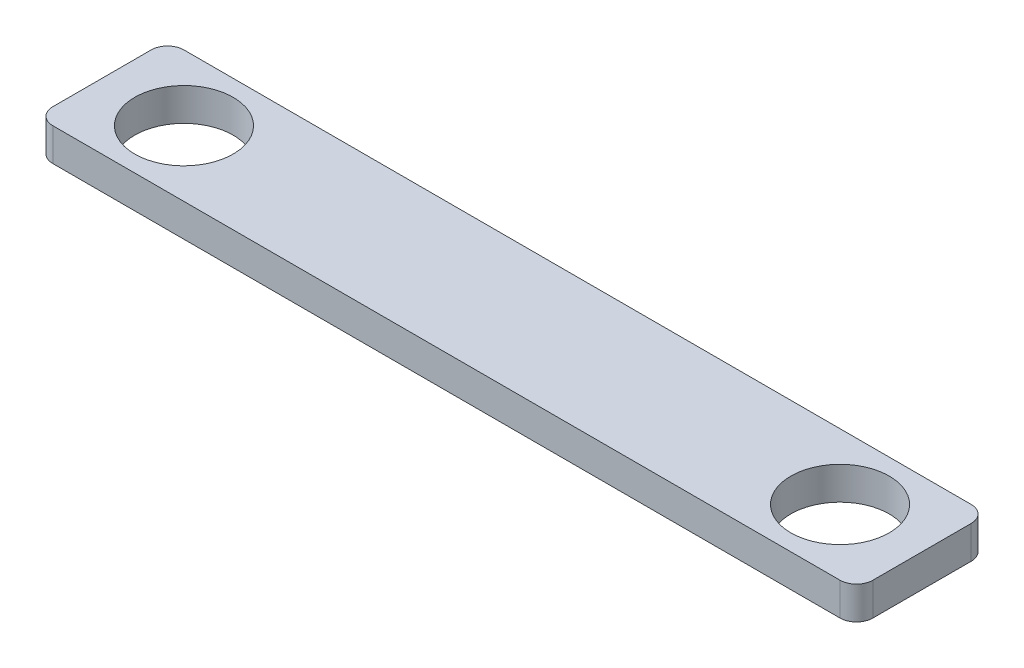
ISO-10303-21;
HEADER;
FILE_DESCRIPTION(('STEP AP214'),'2;1');
FILE_NAME('part.step','',(''),(''),'','','');
FILE_SCHEMA(('AUTOMOTIVE_DESIGN { 1 0 10303 214 1 1 1 1 }'));
ENDSEC;
DATA;
#1=APPLICATION_CONTEXT('core data for automotive mechanical design processes');
#2=APPLICATION_PROTOCOL_DEFINITION('international standard','automotive_design',2000,#1);
#3=PRODUCT_CONTEXT('',#1,'mechanical');
#4=PRODUCT('Part','Part','',(#3));
#5=PRODUCT_RELATED_PRODUCT_CATEGORY('part','',(#4));
#6=PRODUCT_DEFINITION_FORMATION('','',#4);
#7=PRODUCT_DEFINITION_CONTEXT('part definition',#1,'design');
#8=PRODUCT_DEFINITION('design','',#6,#7);
#9=PRODUCT_DEFINITION_SHAPE('','',#8);
#10=(LENGTH_UNIT() NAMED_UNIT(*) SI_UNIT(.MILLI.,.METRE.));
#11=(NAMED_UNIT(*) PLANE_ANGLE_UNIT() SI_UNIT($,.RADIAN.));
#12=(NAMED_UNIT(*) SI_UNIT($,.STERADIAN.) SOLID_ANGLE_UNIT());
#13=UNCERTAINTY_MEASURE_WITH_UNIT(LENGTH_MEASURE(1.E-05),#10,'distance_accuracy_value','');
#14=(GEOMETRIC_REPRESENTATION_CONTEXT(3) GLOBAL_UNCERTAINTY_ASSIGNED_CONTEXT((#13)) GLOBAL_UNIT_ASSIGNED_CONTEXT((#10,
#11,#12)) REPRESENTATION_CONTEXT('',''));
#15=CARTESIAN_POINT('',(0.,0.,0.));
#16=DIRECTION('',(0.,0.,1.));
#17=DIRECTION('',(1.,0.,0.));
#18=AXIS2_PLACEMENT_3D('',#15,#16,#17);
#19=CARTESIAN_POINT('',(60.9600000000001,5.08,7.61999999999998));
#20=DIRECTION('',(0.,1.,0.));
#21=DIRECTION('',(0.,0.,1.));
#22=AXIS2_PLACEMENT_3D('',#19,#20,#21);
#23=PLANE('',#22);
#24=CARTESIAN_POINT('',(-50.8,5.08,0.));
#25=DIRECTION('',(0.,1.,0.));
#26=DIRECTION('',(0.,0.,1.));
#27=AXIS2_PLACEMENT_3D('',#24,#25,#26);
#28=CIRCLE('',#27,7.62);
#29=CARTESIAN_POINT('',(-50.8,5.08,7.62));
#30=VERTEX_POINT('',#29);
#31=EDGE_CURVE('E133',#30,#30,#28,.T.);
#32=ORIENTED_EDGE('',*,*,#31,.F.);
#33=EDGE_LOOP('',(#32));
#34=FACE_BOUND('',#33,.T.);
#35=CARTESIAN_POINT('',(60.9600000000001,5.08,7.61999999999998));
#36=DIRECTION('',(0.,1.,0.));
#37=DIRECTION('',(0.,0.,1.));
#38=AXIS2_PLACEMENT_3D('',#35,#36,#37);
#39=CIRCLE('',#38,2.54);
#40=CARTESIAN_POINT('',(60.96,5.08,10.16));
#41=VERTEX_POINT('',#40);
#42=CARTESIAN_POINT('',(63.5000000000001,5.08,7.61999999999996));
#43=VERTEX_POINT('',#42);
#44=EDGE_CURVE('E144',#41,#43,#39,.T.);
#45=ORIENTED_EDGE('',*,*,#44,.T.);
#46=DIRECTION('',(0.,0.,-1.));
#47=VECTOR('',#46,1.);
#48=CARTESIAN_POINT('',(63.5000000000001,5.08,7.61999999999996));
#49=LINE('',#48,#47);
#50=CARTESIAN_POINT('',(63.5000000000001,5.08,-7.62000000000001));
#51=VERTEX_POINT('',#50);
#52=EDGE_CURVE('E92',#43,#51,#49,.T.);
#53=ORIENTED_EDGE('',*,*,#52,.T.);
#54=CARTESIAN_POINT('',(60.9600000000001,5.08,-7.62000000000002));
#55=DIRECTION('',(0.,1.,0.));
#56=DIRECTION('',(0.,0.,1.));
#57=AXIS2_PLACEMENT_3D('',#54,#55,#56);
#58=CIRCLE('',#57,2.54);
#59=CARTESIAN_POINT('',(60.96,5.08,-10.16));
#60=VERTEX_POINT('',#59);
#61=EDGE_CURVE('E159',#51,#60,#58,.T.);
#62=ORIENTED_EDGE('',*,*,#61,.T.);
#63=DIRECTION('',(-1.,0.,0.));
#64=VECTOR('',#63,1.);
#65=CARTESIAN_POINT('',(60.96,5.08,-10.16));
#66=LINE('',#65,#64);
#67=CARTESIAN_POINT('',(-60.9599999999999,5.08,-10.16));
#68=VERTEX_POINT('',#67);
#69=EDGE_CURVE('E172',#60,#68,#66,.T.);
#70=ORIENTED_EDGE('',*,*,#69,.T.);
#71=CARTESIAN_POINT('',(-60.9599999999999,5.08,-7.61999999999996));
#72=DIRECTION('',(0.,1.,0.));
#73=DIRECTION('',(0.,0.,-1.));
#74=AXIS2_PLACEMENT_3D('',#71,#72,#73);
#75=CIRCLE('',#74,2.54);
#76=CARTESIAN_POINT('',(-63.4999999999999,5.08,-7.61999999999995));
#77=VERTEX_POINT('',#76);
#78=EDGE_CURVE('E111',#68,#77,#75,.T.);
#79=ORIENTED_EDGE('',*,*,#78,.T.);
#80=DIRECTION('',(0.,0.,1.));
#81=VECTOR('',#80,1.);
#82=CARTESIAN_POINT('',(-63.4999999999999,5.08,7.61999999999995));
#83=LINE('',#82,#81);
#84=CARTESIAN_POINT('',(-63.4999999999999,5.08,7.61999999999995));
#85=VERTEX_POINT('',#84);
#86=EDGE_CURVE('E105',#77,#85,#83,.T.);
#87=ORIENTED_EDGE('',*,*,#86,.T.);
#88=CARTESIAN_POINT('',(-60.9599999999999,5.08,7.61999999999996));
#89=DIRECTION('',(0.,1.,0.));
#90=DIRECTION('',(0.,0.,-1.));
#91=AXIS2_PLACEMENT_3D('',#88,#89,#90);
#92=CIRCLE('',#91,2.54);
#93=CARTESIAN_POINT('',(-60.9599999999999,5.08,10.16));
#94=VERTEX_POINT('',#93);
#95=EDGE_CURVE('E109',#85,#94,#92,.T.);
#96=ORIENTED_EDGE('',*,*,#95,.T.);
#97=DIRECTION('',(1.,0.,0.));
#98=VECTOR('',#97,1.);
#99=CARTESIAN_POINT('',(60.96,5.08,10.16));
#100=LINE('',#99,#98);
#101=EDGE_CURVE('E49',#94,#41,#100,.T.);
#102=ORIENTED_EDGE('',*,*,#101,.T.);
#103=EDGE_LOOP('',(#45,#53,#62,#70,#79,#87,#96,#102));
#104=FACE_BOUND('',#103,.T.);
#105=CARTESIAN_POINT('',(50.8,5.08,0.));
#106=DIRECTION('',(0.,1.,0.));
#107=DIRECTION('',(0.,0.,1.));
#108=AXIS2_PLACEMENT_3D('',#105,#106,#107);
#109=CIRCLE('',#108,7.62);
#110=CARTESIAN_POINT('',(50.8,5.08,7.62));
#111=VERTEX_POINT('',#110);
#112=EDGE_CURVE('E181',#111,#111,#109,.T.);
#113=ORIENTED_EDGE('',*,*,#112,.F.);
#114=EDGE_LOOP('',(#113));
#115=FACE_BOUND('',#114,.T.);
#116=ADVANCED_FACE('F32',(#34,#104,#115),#23,.T.);
#117=CARTESIAN_POINT('',(60.9600000000001,0.,7.61999999999998));
#118=DIRECTION('',(0.,1.,0.));
#119=DIRECTION('',(0.,0.,1.));
#120=AXIS2_PLACEMENT_3D('',#117,#118,#119);
#121=PLANE('',#120);
#122=CARTESIAN_POINT('',(60.9600000000001,0.,7.61999999999998));
#123=DIRECTION('',(0.,1.,0.));
#124=DIRECTION('',(0.,0.,1.));
#125=AXIS2_PLACEMENT_3D('',#122,#123,#124);
#126=CIRCLE('',#125,2.54);
#127=CARTESIAN_POINT('',(60.96,0.,10.16));
#128=VERTEX_POINT('',#127);
#129=CARTESIAN_POINT('',(63.5000000000001,0.,7.61999999999996));
#130=VERTEX_POINT('',#129);
#131=EDGE_CURVE('E129',#128,#130,#126,.T.);
#132=ORIENTED_EDGE('',*,*,#131,.F.);
#133=DIRECTION('',(1.,0.,0.));
#134=VECTOR('',#133,1.);
#135=CARTESIAN_POINT('',(60.96,0.,10.16));
#136=LINE('',#135,#134);
#137=CARTESIAN_POINT('',(-60.9599999999999,0.,10.16));
#138=VERTEX_POINT('',#137);
#139=EDGE_CURVE('E84',#138,#128,#136,.T.);
#140=ORIENTED_EDGE('',*,*,#139,.F.);
#141=CARTESIAN_POINT('',(-60.9599999999999,0.,7.61999999999996));
#142=DIRECTION('',(0.,1.,0.));
#143=DIRECTION('',(0.,0.,-1.));
#144=AXIS2_PLACEMENT_3D('',#141,#142,#143);
#145=CIRCLE('',#144,2.54);
#146=CARTESIAN_POINT('',(-63.4999999999999,0.,7.61999999999995));
#147=VERTEX_POINT('',#146);
#148=EDGE_CURVE('E78',#147,#138,#145,.T.);
#149=ORIENTED_EDGE('',*,*,#148,.F.);
#150=DIRECTION('',(0.,0.,1.));
#151=VECTOR('',#150,1.);
#152=CARTESIAN_POINT('',(-63.4999999999999,0.,7.61999999999995));
#153=LINE('',#152,#151);
#154=CARTESIAN_POINT('',(-63.4999999999999,0.,-7.61999999999995));
#155=VERTEX_POINT('',#154);
#156=EDGE_CURVE('E119',#155,#147,#153,.T.);
#157=ORIENTED_EDGE('',*,*,#156,.F.);
#158=CARTESIAN_POINT('',(-60.9599999999999,0.,-7.61999999999996));
#159=DIRECTION('',(0.,1.,0.));
#160=DIRECTION('',(0.,0.,-1.));
#161=AXIS2_PLACEMENT_3D('',#158,#159,#160);
#162=CIRCLE('',#161,2.54);
#163=CARTESIAN_POINT('',(-60.9599999999999,0.,-10.16));
#164=VERTEX_POINT('',#163);
#165=EDGE_CURVE('E139',#164,#155,#162,.T.);
#166=ORIENTED_EDGE('',*,*,#165,.F.);
#167=DIRECTION('',(-1.,0.,0.));
#168=VECTOR('',#167,1.);
#169=CARTESIAN_POINT('',(60.96,0.,-10.16));
#170=LINE('',#169,#168);
#171=CARTESIAN_POINT('',(60.96,0.,-10.16));
#172=VERTEX_POINT('',#171);
#173=EDGE_CURVE('E137',#172,#164,#170,.T.);
#174=ORIENTED_EDGE('',*,*,#173,.F.);
#175=CARTESIAN_POINT('',(60.9600000000001,0.,-7.62000000000002));
#176=DIRECTION('',(0.,1.,0.));
#177=DIRECTION('',(0.,0.,1.));
#178=AXIS2_PLACEMENT_3D('',#175,#176,#177);
#179=CIRCLE('',#178,2.54);
#180=CARTESIAN_POINT('',(63.5000000000001,0.,-7.62000000000001));
#181=VERTEX_POINT('',#180);
#182=EDGE_CURVE('E135',#181,#172,#179,.T.);
#183=ORIENTED_EDGE('',*,*,#182,.F.);
#184=DIRECTION('',(0.,0.,-1.));
#185=VECTOR('',#184,1.);
#186=CARTESIAN_POINT('',(63.5000000000001,0.,7.61999999999996));
#187=LINE('',#186,#185);
#188=EDGE_CURVE('E132',#130,#181,#187,.T.);
#189=ORIENTED_EDGE('',*,*,#188,.F.);
#190=EDGE_LOOP('',(#132,#140,#149,#157,#166,#174,#183,#189));
#191=FACE_BOUND('',#190,.T.);
#192=CARTESIAN_POINT('',(-50.8,0.,0.));
#193=DIRECTION('',(0.,1.,0.));
#194=DIRECTION('',(0.,0.,1.));
#195=AXIS2_PLACEMENT_3D('',#192,#193,#194);
#196=CIRCLE('',#195,7.62);
#197=CARTESIAN_POINT('',(-50.8,0.,7.62));
#198=VERTEX_POINT('',#197);
#199=EDGE_CURVE('E178',#198,#198,#196,.T.);
#200=ORIENTED_EDGE('',*,*,#199,.T.);
#201=EDGE_LOOP('',(#200));
#202=FACE_BOUND('',#201,.T.);
#203=CARTESIAN_POINT('',(50.8,0.,0.));
#204=DIRECTION('',(0.,1.,0.));
#205=DIRECTION('',(0.,0.,1.));
#206=AXIS2_PLACEMENT_3D('',#203,#204,#205);
#207=CIRCLE('',#206,7.62);
#208=CARTESIAN_POINT('',(50.8,0.,7.62));
#209=VERTEX_POINT('',#208);
#210=EDGE_CURVE('E184',#209,#209,#207,.T.);
#211=ORIENTED_EDGE('',*,*,#210,.T.);
#212=EDGE_LOOP('',(#211));
#213=FACE_BOUND('',#212,.T.);
#214=ADVANCED_FACE('F163',(#191,#202,#213),#121,.F.);
#215=CARTESIAN_POINT('',(60.9600000000001,5.08,7.61999999999998));
#216=DIRECTION('',(0.,-1.,0.));
#217=DIRECTION('',(0.,0.,-1.));
#218=AXIS2_PLACEMENT_3D('',#215,#216,#217);
#219=CYLINDRICAL_SURFACE('',#218,2.54);
#220=ORIENTED_EDGE('',*,*,#131,.T.);
#221=DIRECTION('',(0.,-1.,0.));
#222=VECTOR('',#221,1.);
#223=CARTESIAN_POINT('',(63.5000000000001,5.08,7.61999999999996));
#224=LINE('',#223,#222);
#225=EDGE_CURVE('E11',#43,#130,#224,.T.);
#226=ORIENTED_EDGE('',*,*,#225,.F.);
#227=ORIENTED_EDGE('',*,*,#44,.F.);
#228=DIRECTION('',(0.,-1.,0.));
#229=VECTOR('',#228,1.);
#230=CARTESIAN_POINT('',(60.96,5.08,10.16));
#231=LINE('',#230,#229);
#232=EDGE_CURVE('E125',#41,#128,#231,.T.);
#233=ORIENTED_EDGE('',*,*,#232,.T.);
#234=EDGE_LOOP('',(#220,#226,#227,#233));
#235=FACE_BOUND('',#234,.T.);
#236=ADVANCED_FACE('F34',(#235),#219,.T.);
#237=CARTESIAN_POINT('',(63.5000000000001,5.08,7.61999999999996));
#238=DIRECTION('',(-1.,0.,0.));
#239=DIRECTION('',(0.,0.,1.));
#240=AXIS2_PLACEMENT_3D('',#237,#238,#239);
#241=PLANE('',#240);
#242=ORIENTED_EDGE('',*,*,#188,.T.);
#243=DIRECTION('',(0.,-1.,0.));
#244=VECTOR('',#243,1.);
#245=CARTESIAN_POINT('',(63.5000000000001,5.08,-7.62000000000001));
#246=LINE('',#245,#244);
#247=EDGE_CURVE('E41',#51,#181,#246,.T.);
#248=ORIENTED_EDGE('',*,*,#247,.F.);
#249=ORIENTED_EDGE('',*,*,#52,.F.);
#250=ORIENTED_EDGE('',*,*,#225,.T.);
#251=EDGE_LOOP('',(#242,#248,#249,#250));
#252=FACE_BOUND('',#251,.T.);
#253=ADVANCED_FACE('F216',(#252),#241,.F.);
#254=CARTESIAN_POINT('',(60.9600000000001,5.08,-7.62000000000002));
#255=DIRECTION('',(0.,-1.,0.));
#256=DIRECTION('',(0.,0.,-1.));
#257=AXIS2_PLACEMENT_3D('',#254,#255,#256);
#258=CYLINDRICAL_SURFACE('',#257,2.54);
#259=ORIENTED_EDGE('',*,*,#182,.T.);
#260=DIRECTION('',(0.,-1.,0.));
#261=VECTOR('',#260,1.);
#262=CARTESIAN_POINT('',(60.96,5.08,-10.16));
#263=LINE('',#262,#261);
#264=EDGE_CURVE('E151',#60,#172,#263,.T.);
#265=ORIENTED_EDGE('',*,*,#264,.F.);
#266=ORIENTED_EDGE('',*,*,#61,.F.);
#267=ORIENTED_EDGE('',*,*,#247,.T.);
#268=EDGE_LOOP('',(#259,#265,#266,#267));
#269=FACE_BOUND('',#268,.T.);
#270=ADVANCED_FACE('F157',(#269),#258,.T.);
#271=CARTESIAN_POINT('',(60.96,5.08,-10.16));
#272=DIRECTION('',(0.,0.,1.));
#273=DIRECTION('',(1.,0.,0.));
#274=AXIS2_PLACEMENT_3D('',#271,#272,#273);
#275=PLANE('',#274);
#276=ORIENTED_EDGE('',*,*,#173,.T.);
#277=DIRECTION('',(0.,-1.,0.));
#278=VECTOR('',#277,1.);
#279=CARTESIAN_POINT('',(-60.9599999999999,5.08,-10.16));
#280=LINE('',#279,#278);
#281=EDGE_CURVE('E148',#68,#164,#280,.T.);
#282=ORIENTED_EDGE('',*,*,#281,.F.);
#283=ORIENTED_EDGE('',*,*,#69,.F.);
#284=ORIENTED_EDGE('',*,*,#264,.T.);
#285=EDGE_LOOP('',(#276,#282,#283,#284));
#286=FACE_BOUND('',#285,.T.);
#287=ADVANCED_FACE('F168',(#286),#275,.F.);
#288=CARTESIAN_POINT('',(-60.9599999999999,5.08,-7.61999999999996));
#289=DIRECTION('',(0.,-1.,0.));
#290=DIRECTION('',(0.,0.,-1.));
#291=AXIS2_PLACEMENT_3D('',#288,#289,#290);
#292=CYLINDRICAL_SURFACE('',#291,2.54);
#293=ORIENTED_EDGE('',*,*,#165,.T.);
#294=DIRECTION('',(0.,-1.,0.));
#295=VECTOR('',#294,1.);
#296=CARTESIAN_POINT('',(-63.4999999999999,5.08,-7.61999999999995));
#297=LINE('',#296,#295);
#298=EDGE_CURVE('E120',#77,#155,#297,.T.);
#299=ORIENTED_EDGE('',*,*,#298,.F.);
#300=ORIENTED_EDGE('',*,*,#78,.F.);
#301=ORIENTED_EDGE('',*,*,#281,.T.);
#302=EDGE_LOOP('',(#293,#299,#300,#301));
#303=FACE_BOUND('',#302,.T.);
#304=ADVANCED_FACE('F171',(#303),#292,.T.);
#305=CARTESIAN_POINT('',(-63.4999999999999,5.08,7.61999999999995));
#306=DIRECTION('',(1.,0.,0.));
#307=DIRECTION('',(0.,0.,-1.));
#308=AXIS2_PLACEMENT_3D('',#305,#306,#307);
#309=PLANE('',#308);
#310=ORIENTED_EDGE('',*,*,#156,.T.);
#311=DIRECTION('',(0.,-1.,0.));
#312=VECTOR('',#311,1.);
#313=CARTESIAN_POINT('',(-63.4999999999999,5.08,7.61999999999995));
#314=LINE('',#313,#312);
#315=EDGE_CURVE('E116',#85,#147,#314,.T.);
#316=ORIENTED_EDGE('',*,*,#315,.F.);
#317=ORIENTED_EDGE('',*,*,#86,.F.);
#318=ORIENTED_EDGE('',*,*,#298,.T.);
#319=EDGE_LOOP('',(#310,#316,#317,#318));
#320=FACE_BOUND('',#319,.T.);
#321=ADVANCED_FACE('F117',(#320),#309,.F.);
#322=CARTESIAN_POINT('',(-60.9599999999999,5.08,7.61999999999996));
#323=DIRECTION('',(0.,-1.,0.));
#324=DIRECTION('',(0.,0.,-1.));
#325=AXIS2_PLACEMENT_3D('',#322,#323,#324);
#326=CYLINDRICAL_SURFACE('',#325,2.54);
#327=ORIENTED_EDGE('',*,*,#148,.T.);
#328=DIRECTION('',(0.,-1.,0.));
#329=VECTOR('',#328,1.);
#330=CARTESIAN_POINT('',(-60.9599999999999,5.08,10.16));
#331=LINE('',#330,#329);
#332=EDGE_CURVE('E121',#94,#138,#331,.T.);
#333=ORIENTED_EDGE('',*,*,#332,.F.);
#334=ORIENTED_EDGE('',*,*,#95,.F.);
#335=ORIENTED_EDGE('',*,*,#315,.T.);
#336=EDGE_LOOP('',(#327,#333,#334,#335));
#337=FACE_BOUND('',#336,.T.);
#338=ADVANCED_FACE('F123',(#337),#326,.T.);
#339=CARTESIAN_POINT('',(60.96,5.08,10.16));
#340=DIRECTION('',(0.,0.,-1.));
#341=DIRECTION('',(-1.,0.,0.));
#342=AXIS2_PLACEMENT_3D('',#339,#340,#341);
#343=PLANE('',#342);
#344=ORIENTED_EDGE('',*,*,#139,.T.);
#345=ORIENTED_EDGE('',*,*,#232,.F.);
#346=ORIENTED_EDGE('',*,*,#101,.F.);
#347=ORIENTED_EDGE('',*,*,#332,.T.);
#348=EDGE_LOOP('',(#344,#345,#346,#347));
#349=FACE_BOUND('',#348,.T.);
#350=ADVANCED_FACE('F204',(#349),#343,.F.);
#351=CARTESIAN_POINT('',(-50.8,5.08,0.));
#352=DIRECTION('',(0.,-1.,0.));
#353=DIRECTION('',(0.,0.,-1.));
#354=AXIS2_PLACEMENT_3D('',#351,#352,#353);
#355=CYLINDRICAL_SURFACE('',#354,7.62);
#356=ORIENTED_EDGE('',*,*,#31,.T.);
#357=EDGE_LOOP('',(#356));
#358=FACE_BOUND('',#357,.T.);
#359=ORIENTED_EDGE('',*,*,#199,.F.);
#360=EDGE_LOOP('',(#359));
#361=FACE_BOUND('',#360,.T.);
#362=ADVANCED_FACE('F201',(#358,#361),#355,.F.);
#363=CARTESIAN_POINT('',(50.8,5.08,0.));
#364=DIRECTION('',(0.,-1.,0.));
#365=DIRECTION('',(0.,0.,-1.));
#366=AXIS2_PLACEMENT_3D('',#363,#364,#365);
#367=CYLINDRICAL_SURFACE('',#366,7.62);
#368=ORIENTED_EDGE('',*,*,#112,.T.);
#369=EDGE_LOOP('',(#368));
#370=FACE_BOUND('',#369,.T.);
#371=ORIENTED_EDGE('',*,*,#210,.F.);
#372=EDGE_LOOP('',(#371));
#373=FACE_BOUND('',#372,.T.);
#374=ADVANCED_FACE('F190',(#370,#373),#367,.F.);
#375=CLOSED_SHELL('',(#116,#214,#236,#253,#270,#287,#304,#321,#338,#350,#362,#374));
#376=MANIFOLD_SOLID_BREP('B2',#375);
#377=ADVANCED_BREP_SHAPE_REPRESENTATION('',(#18,#376),#14);
#378=SHAPE_DEFINITION_REPRESENTATION(#9,#377);
ENDSEC;
END-ISO-10303-21;
